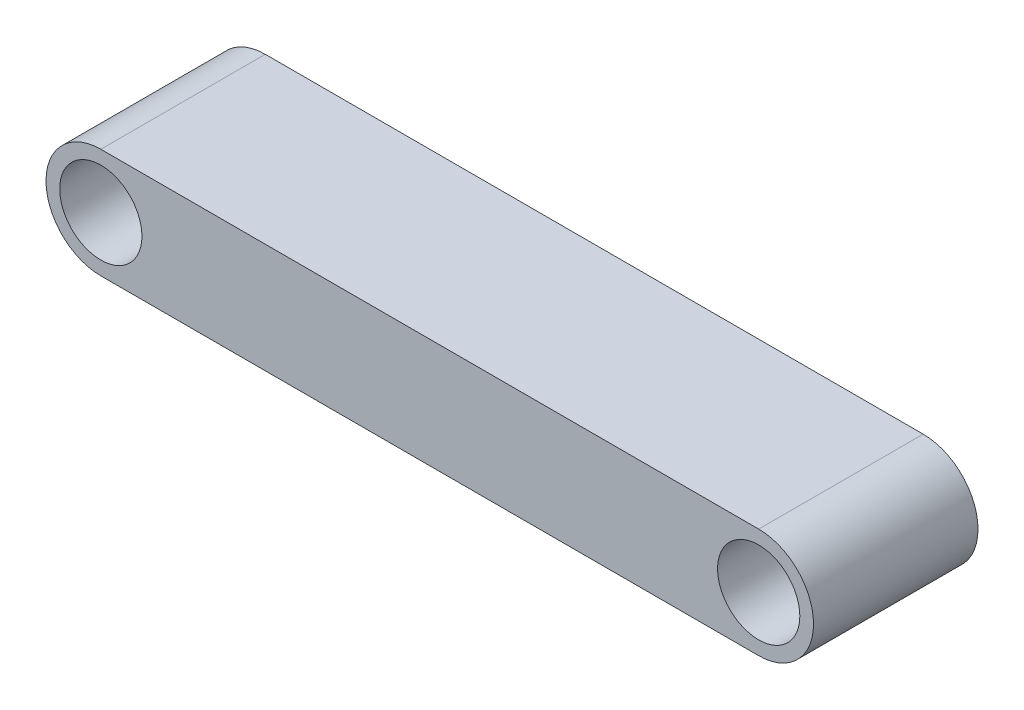
ISO-10303-21;
HEADER;
FILE_DESCRIPTION(('STEP AP214'),'2;1');
FILE_NAME('part.step','',(''),(''),'','','');
FILE_SCHEMA(('AUTOMOTIVE_DESIGN { 1 0 10303 214 1 1 1 1 }'));
ENDSEC;
DATA;
#1=APPLICATION_CONTEXT('core data for automotive mechanical design processes');
#2=APPLICATION_PROTOCOL_DEFINITION('international standard','automotive_design',2000,#1);
#3=PRODUCT_CONTEXT('',#1,'mechanical');
#4=PRODUCT('Part','Part','',(#3));
#5=PRODUCT_RELATED_PRODUCT_CATEGORY('part','',(#4));
#6=PRODUCT_DEFINITION_FORMATION('','',#4);
#7=PRODUCT_DEFINITION_CONTEXT('part definition',#1,'design');
#8=PRODUCT_DEFINITION('design','',#6,#7);
#9=PRODUCT_DEFINITION_SHAPE('','',#8);
#10=(LENGTH_UNIT() NAMED_UNIT(*) SI_UNIT(.MILLI.,.METRE.));
#11=(NAMED_UNIT(*) PLANE_ANGLE_UNIT() SI_UNIT($,.RADIAN.));
#12=(NAMED_UNIT(*) SI_UNIT($,.STERADIAN.) SOLID_ANGLE_UNIT());
#13=UNCERTAINTY_MEASURE_WITH_UNIT(LENGTH_MEASURE(1.E-05),#10,'distance_accuracy_value','');
#14=(GEOMETRIC_REPRESENTATION_CONTEXT(3) GLOBAL_UNCERTAINTY_ASSIGNED_CONTEXT((#13)) GLOBAL_UNIT_ASSIGNED_CONTEXT((#10,
#11,#12)) REPRESENTATION_CONTEXT('',''));
#15=CARTESIAN_POINT('',(0.,0.,0.));
#16=DIRECTION('',(0.,0.,1.));
#17=DIRECTION('',(1.,0.,0.));
#18=AXIS2_PLACEMENT_3D('',#15,#16,#17);
#19=CARTESIAN_POINT('',(0.,0.,6.));
#20=DIRECTION('',(0.,0.,-1.));
#21=DIRECTION('',(-1.,0.,0.));
#22=AXIS2_PLACEMENT_3D('',#19,#20,#21);
#23=PLANE('',#22);
#24=CARTESIAN_POINT('',(0.,0.,6.));
#25=DIRECTION('',(0.,0.,1.));
#26=DIRECTION('',(-1.,0.,0.));
#27=AXIS2_PLACEMENT_3D('',#24,#25,#26);
#28=CIRCLE('',#27,2.);
#29=CARTESIAN_POINT('',(0.,2.,6.));
#30=VERTEX_POINT('',#29);
#31=CARTESIAN_POINT('',(0.,-2.,6.));
#32=VERTEX_POINT('',#31);
#33=EDGE_CURVE('E87',#30,#32,#28,.T.);
#34=ORIENTED_EDGE('',*,*,#33,.T.);
#35=DIRECTION('',(1.,0.,0.));
#36=VECTOR('',#35,1.);
#37=CARTESIAN_POINT('',(0.,-2.,6.));
#38=LINE('',#37,#36);
#39=CARTESIAN_POINT('',(24.,-2.,6.));
#40=VERTEX_POINT('',#39);
#41=EDGE_CURVE('E82',#32,#40,#38,.T.);
#42=ORIENTED_EDGE('',*,*,#41,.T.);
#43=CARTESIAN_POINT('',(24.,0.,6.));
#44=DIRECTION('',(0.,0.,1.));
#45=DIRECTION('',(1.,0.,0.));
#46=AXIS2_PLACEMENT_3D('',#43,#44,#45);
#47=CIRCLE('',#46,2.);
#48=CARTESIAN_POINT('',(24.,2.,6.));
#49=VERTEX_POINT('',#48);
#50=EDGE_CURVE('E85',#40,#49,#47,.T.);
#51=ORIENTED_EDGE('',*,*,#50,.T.);
#52=DIRECTION('',(-1.,0.,0.));
#53=VECTOR('',#52,1.);
#54=CARTESIAN_POINT('',(0.,2.,6.));
#55=LINE('',#54,#53);
#56=EDGE_CURVE('E52',#49,#30,#55,.T.);
#57=ORIENTED_EDGE('',*,*,#56,.T.);
#58=EDGE_LOOP('',(#34,#42,#51,#57));
#59=FACE_BOUND('',#58,.T.);
#60=CARTESIAN_POINT('',(0.,0.,6.));
#61=DIRECTION('',(0.,0.,1.));
#62=DIRECTION('',(1.,0.,0.));
#63=AXIS2_PLACEMENT_3D('',#60,#61,#62);
#64=CIRCLE('',#63,1.5);
#65=CARTESIAN_POINT('',(1.5,0.,6.));
#66=VERTEX_POINT('',#65);
#67=EDGE_CURVE('E102',#66,#66,#64,.T.);
#68=ORIENTED_EDGE('',*,*,#67,.F.);
#69=EDGE_LOOP('',(#68));
#70=FACE_BOUND('',#69,.T.);
#71=CARTESIAN_POINT('',(24.,0.,6.));
#72=DIRECTION('',(0.,0.,1.));
#73=DIRECTION('',(1.,0.,0.));
#74=AXIS2_PLACEMENT_3D('',#71,#72,#73);
#75=CIRCLE('',#74,1.5);
#76=CARTESIAN_POINT('',(25.5,0.,6.));
#77=VERTEX_POINT('',#76);
#78=EDGE_CURVE('E117',#77,#77,#75,.T.);
#79=ORIENTED_EDGE('',*,*,#78,.F.);
#80=EDGE_LOOP('',(#79));
#81=FACE_BOUND('',#80,.T.);
#82=ADVANCED_FACE('F35',(#59,#70,#81),#23,.F.);
#83=CARTESIAN_POINT('',(0.,0.,0.));
#84=DIRECTION('',(0.,0.,-1.));
#85=DIRECTION('',(-1.,0.,0.));
#86=AXIS2_PLACEMENT_3D('',#83,#84,#85);
#87=PLANE('',#86);
#88=CARTESIAN_POINT('',(0.,0.,0.));
#89=DIRECTION('',(0.,0.,1.));
#90=DIRECTION('',(1.,0.,0.));
#91=AXIS2_PLACEMENT_3D('',#88,#89,#90);
#92=CIRCLE('',#91,1.5);
#93=CARTESIAN_POINT('',(1.5,0.,0.));
#94=VERTEX_POINT('',#93);
#95=EDGE_CURVE('E114',#94,#94,#92,.T.);
#96=ORIENTED_EDGE('',*,*,#95,.T.);
#97=EDGE_LOOP('',(#96));
#98=FACE_BOUND('',#97,.T.);
#99=CARTESIAN_POINT('',(0.,0.,0.));
#100=DIRECTION('',(0.,0.,1.));
#101=DIRECTION('',(-1.,0.,0.));
#102=AXIS2_PLACEMENT_3D('',#99,#100,#101);
#103=CIRCLE('',#102,2.);
#104=CARTESIAN_POINT('',(0.,2.,0.));
#105=VERTEX_POINT('',#104);
#106=CARTESIAN_POINT('',(0.,-2.,0.));
#107=VERTEX_POINT('',#106);
#108=EDGE_CURVE('E99',#105,#107,#103,.T.);
#109=ORIENTED_EDGE('',*,*,#108,.F.);
#110=DIRECTION('',(-1.,0.,0.));
#111=VECTOR('',#110,1.);
#112=CARTESIAN_POINT('',(0.,2.,0.));
#113=LINE('',#112,#111);
#114=CARTESIAN_POINT('',(24.,2.,0.));
#115=VERTEX_POINT('',#114);
#116=EDGE_CURVE('E75',#115,#105,#113,.T.);
#117=ORIENTED_EDGE('',*,*,#116,.F.);
#118=CARTESIAN_POINT('',(24.,0.,0.));
#119=DIRECTION('',(0.,0.,1.));
#120=DIRECTION('',(1.,0.,0.));
#121=AXIS2_PLACEMENT_3D('',#118,#119,#120);
#122=CIRCLE('',#121,2.);
#123=CARTESIAN_POINT('',(24.,-2.,0.));
#124=VERTEX_POINT('',#123);
#125=EDGE_CURVE('E69',#124,#115,#122,.T.);
#126=ORIENTED_EDGE('',*,*,#125,.F.);
#127=DIRECTION('',(1.,0.,0.));
#128=VECTOR('',#127,1.);
#129=CARTESIAN_POINT('',(0.,-2.,0.));
#130=LINE('',#129,#128);
#131=EDGE_CURVE('E91',#107,#124,#130,.T.);
#132=ORIENTED_EDGE('',*,*,#131,.F.);
#133=EDGE_LOOP('',(#109,#117,#126,#132));
#134=FACE_BOUND('',#133,.T.);
#135=CARTESIAN_POINT('',(24.,0.,0.));
#136=DIRECTION('',(0.,0.,1.));
#137=DIRECTION('',(1.,0.,0.));
#138=AXIS2_PLACEMENT_3D('',#135,#136,#137);
#139=CIRCLE('',#138,1.5);
#140=CARTESIAN_POINT('',(25.5,0.,0.));
#141=VERTEX_POINT('',#140);
#142=EDGE_CURVE('E120',#141,#141,#139,.T.);
#143=ORIENTED_EDGE('',*,*,#142,.T.);
#144=EDGE_LOOP('',(#143));
#145=FACE_BOUND('',#144,.T.);
#146=ADVANCED_FACE('F110',(#98,#134,#145),#87,.T.);
#147=CARTESIAN_POINT('',(0.,0.,6.));
#148=DIRECTION('',(0.,0.,-1.));
#149=DIRECTION('',(-1.,0.,0.));
#150=AXIS2_PLACEMENT_3D('',#147,#148,#149);
#151=CYLINDRICAL_SURFACE('',#150,2.);
#152=ORIENTED_EDGE('',*,*,#108,.T.);
#153=DIRECTION('',(0.,0.,-1.));
#154=VECTOR('',#153,1.);
#155=CARTESIAN_POINT('',(0.,-2.,6.));
#156=LINE('',#155,#154);
#157=EDGE_CURVE('E11',#32,#107,#156,.T.);
#158=ORIENTED_EDGE('',*,*,#157,.F.);
#159=ORIENTED_EDGE('',*,*,#33,.F.);
#160=DIRECTION('',(0.,0.,-1.));
#161=VECTOR('',#160,1.);
#162=CARTESIAN_POINT('',(0.,2.,6.));
#163=LINE('',#162,#161);
#164=EDGE_CURVE('E95',#30,#105,#163,.T.);
#165=ORIENTED_EDGE('',*,*,#164,.T.);
#166=EDGE_LOOP('',(#152,#158,#159,#165));
#167=FACE_BOUND('',#166,.T.);
#168=ADVANCED_FACE('F37',(#167),#151,.T.);
#169=CARTESIAN_POINT('',(0.,-2.,6.));
#170=DIRECTION('',(0.,1.,0.));
#171=DIRECTION('',(0.,0.,1.));
#172=AXIS2_PLACEMENT_3D('',#169,#170,#171);
#173=PLANE('',#172);
#174=ORIENTED_EDGE('',*,*,#131,.T.);
#175=DIRECTION('',(0.,0.,-1.));
#176=VECTOR('',#175,1.);
#177=CARTESIAN_POINT('',(24.,-2.,6.));
#178=LINE('',#177,#176);
#179=EDGE_CURVE('E44',#40,#124,#178,.T.);
#180=ORIENTED_EDGE('',*,*,#179,.F.);
#181=ORIENTED_EDGE('',*,*,#41,.F.);
#182=ORIENTED_EDGE('',*,*,#157,.T.);
#183=EDGE_LOOP('',(#174,#180,#181,#182));
#184=FACE_BOUND('',#183,.T.);
#185=ADVANCED_FACE('F90',(#184),#173,.F.);
#186=CARTESIAN_POINT('',(24.,0.,6.));
#187=DIRECTION('',(0.,0.,-1.));
#188=DIRECTION('',(-1.,0.,0.));
#189=AXIS2_PLACEMENT_3D('',#186,#187,#188);
#190=CYLINDRICAL_SURFACE('',#189,2.);
#191=ORIENTED_EDGE('',*,*,#125,.T.);
#192=DIRECTION('',(0.,0.,-1.));
#193=VECTOR('',#192,1.);
#194=CARTESIAN_POINT('',(24.,2.,6.));
#195=LINE('',#194,#193);
#196=EDGE_CURVE('E92',#49,#115,#195,.T.);
#197=ORIENTED_EDGE('',*,*,#196,.F.);
#198=ORIENTED_EDGE('',*,*,#50,.F.);
#199=ORIENTED_EDGE('',*,*,#179,.T.);
#200=EDGE_LOOP('',(#191,#197,#198,#199));
#201=FACE_BOUND('',#200,.T.);
#202=ADVANCED_FACE('F93',(#201),#190,.T.);
#203=CARTESIAN_POINT('',(0.,2.,6.));
#204=DIRECTION('',(0.,-1.,0.));
#205=DIRECTION('',(0.,0.,-1.));
#206=AXIS2_PLACEMENT_3D('',#203,#204,#205);
#207=PLANE('',#206);
#208=ORIENTED_EDGE('',*,*,#116,.T.);
#209=ORIENTED_EDGE('',*,*,#164,.F.);
#210=ORIENTED_EDGE('',*,*,#56,.F.);
#211=ORIENTED_EDGE('',*,*,#196,.T.);
#212=EDGE_LOOP('',(#208,#209,#210,#211));
#213=FACE_BOUND('',#212,.T.);
#214=ADVANCED_FACE('F107',(#213),#207,.F.);
#215=CARTESIAN_POINT('',(0.,0.,6.));
#216=DIRECTION('',(0.,0.,-1.));
#217=DIRECTION('',(-1.,0.,0.));
#218=AXIS2_PLACEMENT_3D('',#215,#216,#217);
#219=CYLINDRICAL_SURFACE('',#218,1.5);
#220=ORIENTED_EDGE('',*,*,#67,.T.);
#221=EDGE_LOOP('',(#220));
#222=FACE_BOUND('',#221,.T.);
#223=ORIENTED_EDGE('',*,*,#95,.F.);
#224=EDGE_LOOP('',(#223));
#225=FACE_BOUND('',#224,.T.);
#226=ADVANCED_FACE('F137',(#222,#225),#219,.F.);
#227=CARTESIAN_POINT('',(24.,0.,6.));
#228=DIRECTION('',(0.,0.,-1.));
#229=DIRECTION('',(-1.,0.,0.));
#230=AXIS2_PLACEMENT_3D('',#227,#228,#229);
#231=CYLINDRICAL_SURFACE('',#230,1.5);
#232=ORIENTED_EDGE('',*,*,#78,.T.);
#233=EDGE_LOOP('',(#232));
#234=FACE_BOUND('',#233,.T.);
#235=ORIENTED_EDGE('',*,*,#142,.F.);
#236=EDGE_LOOP('',(#235));
#237=FACE_BOUND('',#236,.T.);
#238=ADVANCED_FACE('F126',(#234,#237),#231,.F.);
#239=CLOSED_SHELL('',(#82,#146,#168,#185,#202,#214,#226,#238));
#240=MANIFOLD_SOLID_BREP('B2',#239);
#241=ADVANCED_BREP_SHAPE_REPRESENTATION('',(#18,#240),#14);
#242=SHAPE_DEFINITION_REPRESENTATION(#9,#241);
ENDSEC;
END-ISO-10303-21;
